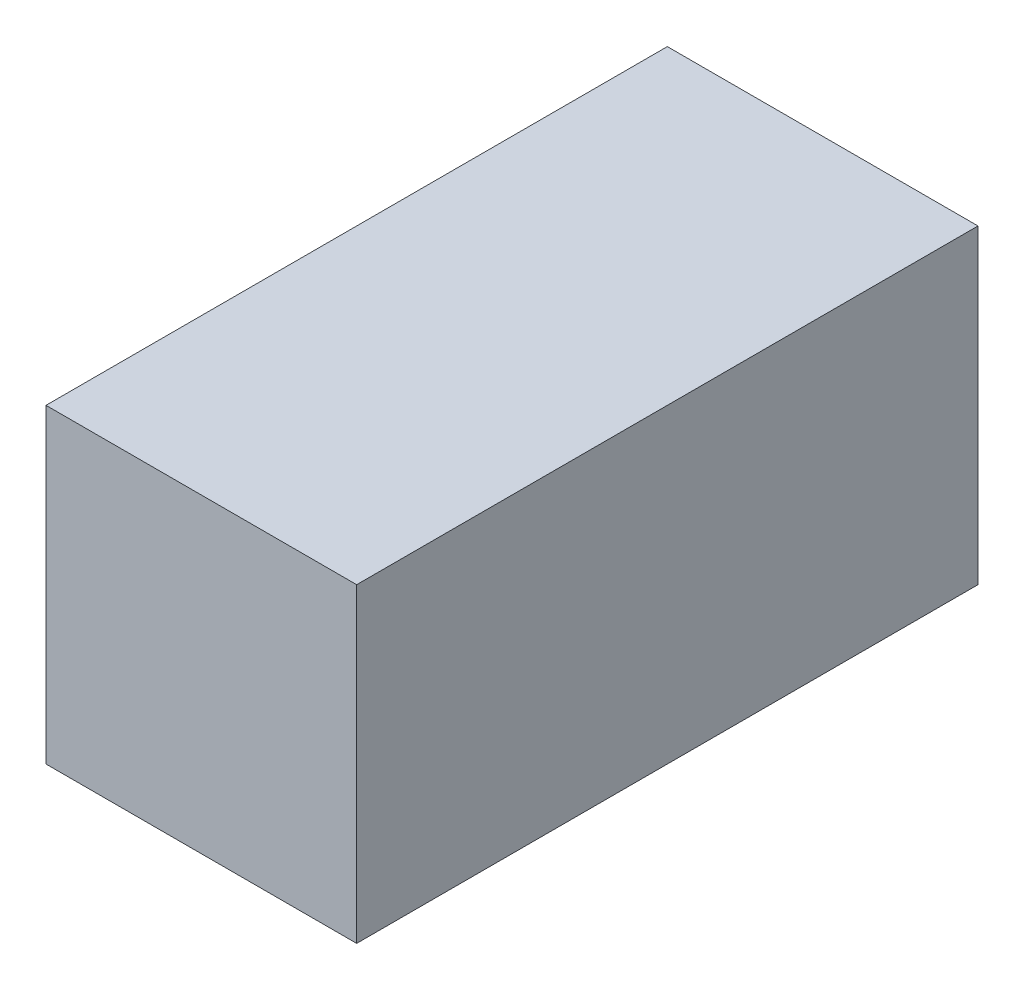
ISO-10303-21;
HEADER;
FILE_DESCRIPTION(('STEP AP214'),'2;1');
FILE_NAME('part.step','',(''),(''),'','','');
FILE_SCHEMA(('AUTOMOTIVE_DESIGN { 1 0 10303 214 1 1 1 1 }'));
ENDSEC;
DATA;
#1=APPLICATION_CONTEXT('core data for automotive mechanical design processes');
#2=APPLICATION_PROTOCOL_DEFINITION('international standard','automotive_design',2000,#1);
#3=PRODUCT_CONTEXT('',#1,'mechanical');
#4=PRODUCT('Part','Part','',(#3));
#5=PRODUCT_RELATED_PRODUCT_CATEGORY('part','',(#4));
#6=PRODUCT_DEFINITION_FORMATION('','',#4);
#7=PRODUCT_DEFINITION_CONTEXT('part definition',#1,'design');
#8=PRODUCT_DEFINITION('design','',#6,#7);
#9=PRODUCT_DEFINITION_SHAPE('','',#8);
#10=(LENGTH_UNIT() NAMED_UNIT(*) SI_UNIT(.MILLI.,.METRE.));
#11=(NAMED_UNIT(*) PLANE_ANGLE_UNIT() SI_UNIT($,.RADIAN.));
#12=(NAMED_UNIT(*) SI_UNIT($,.STERADIAN.) SOLID_ANGLE_UNIT());
#13=UNCERTAINTY_MEASURE_WITH_UNIT(LENGTH_MEASURE(1.E-05),#10,'distance_accuracy_value','');
#14=(GEOMETRIC_REPRESENTATION_CONTEXT(3) GLOBAL_UNCERTAINTY_ASSIGNED_CONTEXT((#13)) GLOBAL_UNIT_ASSIGNED_CONTEXT((#10,
#11,#12)) REPRESENTATION_CONTEXT('',''));
#15=CARTESIAN_POINT('',(0.,0.,0.));
#16=DIRECTION('',(0.,0.,1.));
#17=DIRECTION('',(1.,0.,0.));
#18=AXIS2_PLACEMENT_3D('',#15,#16,#17);
#19=CARTESIAN_POINT('',(-5.,-5.,20.));
#20=DIRECTION('',(1.,0.,0.));
#21=DIRECTION('',(0.,0.,-1.));
#22=AXIS2_PLACEMENT_3D('',#19,#20,#21);
#23=PLANE('',#22);
#24=DIRECTION('',(0.,-1.,0.));
#25=VECTOR('',#24,1.);
#26=CARTESIAN_POINT('',(-5.,-5.,0.));
#27=LINE('',#26,#25);
#28=CARTESIAN_POINT('',(-5.,5.,0.));
#29=VERTEX_POINT('',#28);
#30=CARTESIAN_POINT('',(-5.,-5.,0.));
#31=VERTEX_POINT('',#30);
#32=EDGE_CURVE('E96',#29,#31,#27,.T.);
#33=ORIENTED_EDGE('',*,*,#32,.T.);
#34=DIRECTION('',(0.,0.,-1.));
#35=VECTOR('',#34,1.);
#36=CARTESIAN_POINT('',(-5.,-5.,20.));
#37=LINE('',#36,#35);
#38=CARTESIAN_POINT('',(-5.,-5.,20.));
#39=VERTEX_POINT('',#38);
#40=EDGE_CURVE('E11',#39,#31,#37,.T.);
#41=ORIENTED_EDGE('',*,*,#40,.F.);
#42=DIRECTION('',(0.,-1.,0.));
#43=VECTOR('',#42,1.);
#44=CARTESIAN_POINT('',(-5.,-5.,20.));
#45=LINE('',#44,#43);
#46=CARTESIAN_POINT('',(-5.,5.,20.));
#47=VERTEX_POINT('',#46);
#48=EDGE_CURVE('E84',#47,#39,#45,.T.);
#49=ORIENTED_EDGE('',*,*,#48,.F.);
#50=DIRECTION('',(0.,0.,-1.));
#51=VECTOR('',#50,1.);
#52=CARTESIAN_POINT('',(-5.,5.,20.));
#53=LINE('',#52,#51);
#54=EDGE_CURVE('E92',#47,#29,#53,.T.);
#55=ORIENTED_EDGE('',*,*,#54,.T.);
#56=EDGE_LOOP('',(#33,#41,#49,#55));
#57=FACE_BOUND('',#56,.T.);
#58=ADVANCED_FACE('F33',(#57),#23,.F.);
#59=CARTESIAN_POINT('',(5.,-5.,20.));
#60=DIRECTION('',(0.,1.,0.));
#61=DIRECTION('',(-1.,0.,0.));
#62=AXIS2_PLACEMENT_3D('',#59,#60,#61);
#63=PLANE('',#62);
#64=DIRECTION('',(1.,0.,0.));
#65=VECTOR('',#64,1.);
#66=CARTESIAN_POINT('',(5.,-5.,0.));
#67=LINE('',#66,#65);
#68=CARTESIAN_POINT('',(5.,-5.,0.));
#69=VERTEX_POINT('',#68);
#70=EDGE_CURVE('E88',#31,#69,#67,.T.);
#71=ORIENTED_EDGE('',*,*,#70,.T.);
#72=DIRECTION('',(0.,0.,-1.));
#73=VECTOR('',#72,1.);
#74=CARTESIAN_POINT('',(5.,-5.,20.));
#75=LINE('',#74,#73);
#76=CARTESIAN_POINT('',(5.,-5.,20.));
#77=VERTEX_POINT('',#76);
#78=EDGE_CURVE('E41',#77,#69,#75,.T.);
#79=ORIENTED_EDGE('',*,*,#78,.F.);
#80=DIRECTION('',(1.,0.,0.));
#81=VECTOR('',#80,1.);
#82=CARTESIAN_POINT('',(5.,-5.,20.));
#83=LINE('',#82,#81);
#84=EDGE_CURVE('E79',#39,#77,#83,.T.);
#85=ORIENTED_EDGE('',*,*,#84,.F.);
#86=ORIENTED_EDGE('',*,*,#40,.T.);
#87=EDGE_LOOP('',(#71,#79,#85,#86));
#88=FACE_BOUND('',#87,.T.);
#89=ADVANCED_FACE('F87',(#88),#63,.F.);
#90=CARTESIAN_POINT('',(5.,-5.,20.));
#91=DIRECTION('',(-1.,0.,0.));
#92=DIRECTION('',(0.,0.,1.));
#93=AXIS2_PLACEMENT_3D('',#90,#91,#92);
#94=PLANE('',#93);
#95=DIRECTION('',(0.,1.,0.));
#96=VECTOR('',#95,1.);
#97=CARTESIAN_POINT('',(5.,-5.,0.));
#98=LINE('',#97,#96);
#99=CARTESIAN_POINT('',(5.,5.,0.));
#100=VERTEX_POINT('',#99);
#101=EDGE_CURVE('E66',#69,#100,#98,.T.);
#102=ORIENTED_EDGE('',*,*,#101,.T.);
#103=DIRECTION('',(0.,0.,-1.));
#104=VECTOR('',#103,1.);
#105=CARTESIAN_POINT('',(5.,5.,20.));
#106=LINE('',#105,#104);
#107=CARTESIAN_POINT('',(5.,5.,20.));
#108=VERTEX_POINT('',#107);
#109=EDGE_CURVE('E89',#108,#100,#106,.T.);
#110=ORIENTED_EDGE('',*,*,#109,.F.);
#111=DIRECTION('',(0.,1.,0.));
#112=VECTOR('',#111,1.);
#113=CARTESIAN_POINT('',(5.,-5.,20.));
#114=LINE('',#113,#112);
#115=EDGE_CURVE('E82',#77,#108,#114,.T.);
#116=ORIENTED_EDGE('',*,*,#115,.F.);
#117=ORIENTED_EDGE('',*,*,#78,.T.);
#118=EDGE_LOOP('',(#102,#110,#116,#117));
#119=FACE_BOUND('',#118,.T.);
#120=ADVANCED_FACE('F90',(#119),#94,.F.);
#121=CARTESIAN_POINT('',(5.,5.,20.));
#122=DIRECTION('',(0.,-1.,0.));
#123=DIRECTION('',(0.,0.,-1.));
#124=AXIS2_PLACEMENT_3D('',#121,#122,#123);
#125=PLANE('',#124);
#126=DIRECTION('',(-1.,0.,0.));
#127=VECTOR('',#126,1.);
#128=CARTESIAN_POINT('',(5.,5.,0.));
#129=LINE('',#128,#127);
#130=EDGE_CURVE('E72',#100,#29,#129,.T.);
#131=ORIENTED_EDGE('',*,*,#130,.T.);
#132=ORIENTED_EDGE('',*,*,#54,.F.);
#133=DIRECTION('',(-1.,0.,0.));
#134=VECTOR('',#133,1.);
#135=CARTESIAN_POINT('',(5.,5.,20.));
#136=LINE('',#135,#134);
#137=EDGE_CURVE('E49',#108,#47,#136,.T.);
#138=ORIENTED_EDGE('',*,*,#137,.F.);
#139=ORIENTED_EDGE('',*,*,#109,.T.);
#140=EDGE_LOOP('',(#131,#132,#138,#139));
#141=FACE_BOUND('',#140,.T.);
#142=ADVANCED_FACE('F103',(#141),#125,.F.);
#143=CARTESIAN_POINT('',(0.,0.,20.));
#144=DIRECTION('',(0.,0.,1.));
#145=DIRECTION('',(1.,0.,0.));
#146=AXIS2_PLACEMENT_3D('',#143,#144,#145);
#147=PLANE('',#146);
#148=ORIENTED_EDGE('',*,*,#48,.T.);
#149=ORIENTED_EDGE('',*,*,#84,.T.);
#150=ORIENTED_EDGE('',*,*,#115,.T.);
#151=ORIENTED_EDGE('',*,*,#137,.T.);
#152=EDGE_LOOP('',(#148,#149,#150,#151));
#153=FACE_BOUND('',#152,.T.);
#154=ADVANCED_FACE('F80',(#153),#147,.T.);
#155=CARTESIAN_POINT('',(0.,0.,0.));
#156=DIRECTION('',(0.,0.,1.));
#157=DIRECTION('',(1.,0.,0.));
#158=AXIS2_PLACEMENT_3D('',#155,#156,#157);
#159=PLANE('',#158);
#160=ORIENTED_EDGE('',*,*,#32,.F.);
#161=ORIENTED_EDGE('',*,*,#130,.F.);
#162=ORIENTED_EDGE('',*,*,#101,.F.);
#163=ORIENTED_EDGE('',*,*,#70,.F.);
#164=EDGE_LOOP('',(#160,#161,#162,#163));
#165=FACE_BOUND('',#164,.T.);
#166=ADVANCED_FACE('F106',(#165),#159,.F.);
#167=CLOSED_SHELL('',(#58,#89,#120,#142,#154,#166));
#168=MANIFOLD_SOLID_BREP('B2',#167);
#169=ADVANCED_BREP_SHAPE_REPRESENTATION('',(#18,#168),#14);
#170=SHAPE_DEFINITION_REPRESENTATION(#9,#169);
ENDSEC;
END-ISO-10303-21;
